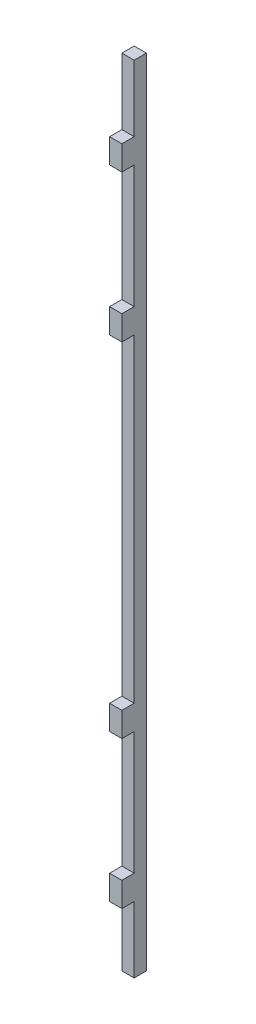
ISO-10303-21;
HEADER;
FILE_DESCRIPTION(('STEP AP214'),'2;1');
FILE_NAME('part.step','',(''),(''),'','','');
FILE_SCHEMA(('AUTOMOTIVE_DESIGN { 1 0 10303 214 1 1 1 1 }'));
ENDSEC;
DATA;
#1=APPLICATION_CONTEXT('core data for automotive mechanical design processes');
#2=APPLICATION_PROTOCOL_DEFINITION('international standard','automotive_design',2000,#1);
#3=PRODUCT_CONTEXT('',#1,'mechanical');
#4=PRODUCT('Part','Part','',(#3));
#5=PRODUCT_RELATED_PRODUCT_CATEGORY('part','',(#4));
#6=PRODUCT_DEFINITION_FORMATION('','',#4);
#7=PRODUCT_DEFINITION_CONTEXT('part definition',#1,'design');
#8=PRODUCT_DEFINITION('design','',#6,#7);
#9=PRODUCT_DEFINITION_SHAPE('','',#8);
#10=(LENGTH_UNIT() NAMED_UNIT(*) SI_UNIT(.MILLI.,.METRE.));
#11=(NAMED_UNIT(*) PLANE_ANGLE_UNIT() SI_UNIT($,.RADIAN.));
#12=(NAMED_UNIT(*) SI_UNIT($,.STERADIAN.) SOLID_ANGLE_UNIT());
#13=UNCERTAINTY_MEASURE_WITH_UNIT(LENGTH_MEASURE(1.E-05),#10,'distance_accuracy_value','');
#14=(GEOMETRIC_REPRESENTATION_CONTEXT(3) GLOBAL_UNCERTAINTY_ASSIGNED_CONTEXT((#13)) GLOBAL_UNIT_ASSIGNED_CONTEXT((#10,
#11,#12)) REPRESENTATION_CONTEXT('',''));
#15=CARTESIAN_POINT('',(0.,0.,0.));
#16=DIRECTION('',(0.,0.,1.));
#17=DIRECTION('',(1.,0.,0.));
#18=AXIS2_PLACEMENT_3D('',#15,#16,#17);
#19=CARTESIAN_POINT('',(2.5,0.,-5.));
#20=DIRECTION('',(0.,0.,1.));
#21=DIRECTION('',(1.,0.,0.));
#22=AXIS2_PLACEMENT_3D('',#19,#20,#21);
#23=PLANE('',#22);
#24=DIRECTION('',(0.,1.,0.));
#25=VECTOR('',#24,1.);
#26=CARTESIAN_POINT('',(-2.5,0.,-5.));
#27=LINE('',#26,#25);
#28=CARTESIAN_POINT('',(-2.5,-162.,-5.));
#29=VERTEX_POINT('',#28);
#30=CARTESIAN_POINT('',(-2.5,162.,-5.));
#31=VERTEX_POINT('',#30);
#32=EDGE_CURVE('E153',#29,#31,#27,.T.);
#33=ORIENTED_EDGE('',*,*,#32,.T.);
#34=DIRECTION('',(-1.,0.,0.));
#35=VECTOR('',#34,1.);
#36=CARTESIAN_POINT('',(2.5,162.,-5.));
#37=LINE('',#36,#35);
#38=CARTESIAN_POINT('',(2.5,162.,-5.));
#39=VERTEX_POINT('',#38);
#40=EDGE_CURVE('E11',#39,#31,#37,.T.);
#41=ORIENTED_EDGE('',*,*,#40,.F.);
#42=DIRECTION('',(0.,1.,0.));
#43=VECTOR('',#42,1.);
#44=CARTESIAN_POINT('',(2.5,0.,-5.));
#45=LINE('',#44,#43);
#46=CARTESIAN_POINT('',(2.5,-162.,-5.));
#47=VERTEX_POINT('',#46);
#48=EDGE_CURVE('E213',#47,#39,#45,.T.);
#49=ORIENTED_EDGE('',*,*,#48,.F.);
#50=DIRECTION('',(-1.,0.,0.));
#51=VECTOR('',#50,1.);
#52=CARTESIAN_POINT('',(2.5,-162.,-5.));
#53=LINE('',#52,#51);
#54=EDGE_CURVE('E258',#47,#29,#53,.T.);
#55=ORIENTED_EDGE('',*,*,#54,.T.);
#56=EDGE_LOOP('',(#33,#41,#49,#55));
#57=FACE_BOUND('',#56,.T.);
#58=ADVANCED_FACE('F40',(#57),#23,.F.);
#59=CARTESIAN_POINT('',(2.5,162.,0.));
#60=DIRECTION('',(0.,-1.,0.));
#61=DIRECTION('',(0.,0.,-1.));
#62=AXIS2_PLACEMENT_3D('',#59,#60,#61);
#63=PLANE('',#62);
#64=DIRECTION('',(0.,0.,1.));
#65=VECTOR('',#64,1.);
#66=CARTESIAN_POINT('',(-2.5,162.,0.));
#67=LINE('',#66,#65);
#68=CARTESIAN_POINT('',(-2.5,162.,0.));
#69=VERTEX_POINT('',#68);
#70=EDGE_CURVE('E156',#31,#69,#67,.T.);
#71=ORIENTED_EDGE('',*,*,#70,.T.);
#72=DIRECTION('',(-1.,0.,0.));
#73=VECTOR('',#72,1.);
#74=CARTESIAN_POINT('',(2.5,162.,0.));
#75=LINE('',#74,#73);
#76=CARTESIAN_POINT('',(2.5,162.,0.));
#77=VERTEX_POINT('',#76);
#78=EDGE_CURVE('E48',#77,#69,#75,.T.);
#79=ORIENTED_EDGE('',*,*,#78,.F.);
#80=DIRECTION('',(0.,0.,1.));
#81=VECTOR('',#80,1.);
#82=CARTESIAN_POINT('',(2.5,162.,0.));
#83=LINE('',#82,#81);
#84=EDGE_CURVE('E101',#39,#77,#83,.T.);
#85=ORIENTED_EDGE('',*,*,#84,.F.);
#86=ORIENTED_EDGE('',*,*,#40,.T.);
#87=EDGE_LOOP('',(#71,#79,#85,#86));
#88=FACE_BOUND('',#87,.T.);
#89=ADVANCED_FACE('F196',(#88),#63,.F.);
#90=CARTESIAN_POINT('',(2.5,0.,0.));
#91=DIRECTION('',(0.,0.,1.));
#92=DIRECTION('',(1.,0.,0.));
#93=AXIS2_PLACEMENT_3D('',#90,#91,#92);
#94=PLANE('',#93);
#95=DIRECTION('',(0.,1.,0.));
#96=VECTOR('',#95,1.);
#97=CARTESIAN_POINT('',(-2.5,0.,0.));
#98=LINE('',#97,#96);
#99=CARTESIAN_POINT('',(-2.5,135.,0.));
#100=VERTEX_POINT('',#99);
#101=EDGE_CURVE('E160',#100,#69,#98,.T.);
#102=ORIENTED_EDGE('',*,*,#101,.F.);
#103=DIRECTION('',(-1.,0.,0.));
#104=VECTOR('',#103,1.);
#105=CARTESIAN_POINT('',(2.5,135.,0.));
#106=LINE('',#105,#104);
#107=CARTESIAN_POINT('',(2.5,135.,0.));
#108=VERTEX_POINT('',#107);
#109=EDGE_CURVE('E189',#108,#100,#106,.T.);
#110=ORIENTED_EDGE('',*,*,#109,.F.);
#111=DIRECTION('',(0.,1.,0.));
#112=VECTOR('',#111,1.);
#113=CARTESIAN_POINT('',(2.5,0.,0.));
#114=LINE('',#113,#112);
#115=EDGE_CURVE('E195',#108,#77,#114,.T.);
#116=ORIENTED_EDGE('',*,*,#115,.T.);
#117=ORIENTED_EDGE('',*,*,#78,.T.);
#118=EDGE_LOOP('',(#102,#110,#116,#117));
#119=FACE_BOUND('',#118,.T.);
#120=ADVANCED_FACE('F193',(#119),#94,.T.);
#121=CARTESIAN_POINT('',(2.5,135.,0.));
#122=DIRECTION('',(0.,-1.,0.));
#123=DIRECTION('',(0.,0.,-1.));
#124=AXIS2_PLACEMENT_3D('',#121,#122,#123);
#125=PLANE('',#124);
#126=DIRECTION('',(0.,0.,1.));
#127=VECTOR('',#126,1.);
#128=CARTESIAN_POINT('',(-2.5,135.,0.));
#129=LINE('',#128,#127);
#130=CARTESIAN_POINT('',(-2.5,135.,5.));
#131=VERTEX_POINT('',#130);
#132=EDGE_CURVE('E163',#100,#131,#129,.T.);
#133=ORIENTED_EDGE('',*,*,#132,.T.);
#134=DIRECTION('',(-1.,0.,0.));
#135=VECTOR('',#134,1.);
#136=CARTESIAN_POINT('',(2.5,135.,5.));
#137=LINE('',#136,#135);
#138=CARTESIAN_POINT('',(2.5,135.,5.));
#139=VERTEX_POINT('',#138);
#140=EDGE_CURVE('E187',#139,#131,#137,.T.);
#141=ORIENTED_EDGE('',*,*,#140,.F.);
#142=DIRECTION('',(0.,0.,1.));
#143=VECTOR('',#142,1.);
#144=CARTESIAN_POINT('',(2.5,135.,0.));
#145=LINE('',#144,#143);
#146=EDGE_CURVE('E208',#108,#139,#145,.T.);
#147=ORIENTED_EDGE('',*,*,#146,.F.);
#148=ORIENTED_EDGE('',*,*,#109,.T.);
#149=EDGE_LOOP('',(#133,#141,#147,#148));
#150=FACE_BOUND('',#149,.T.);
#151=ADVANCED_FACE('F205',(#150),#125,.F.);
#152=CARTESIAN_POINT('',(2.5,0.,5.));
#153=DIRECTION('',(0.,0.,1.));
#154=DIRECTION('',(1.,0.,0.));
#155=AXIS2_PLACEMENT_3D('',#152,#153,#154);
#156=PLANE('',#155);
#157=DIRECTION('',(0.,1.,0.));
#158=VECTOR('',#157,1.);
#159=CARTESIAN_POINT('',(-2.5,0.,5.));
#160=LINE('',#159,#158);
#161=CARTESIAN_POINT('',(-2.5,125.,5.));
#162=VERTEX_POINT('',#161);
#163=EDGE_CURVE('E168',#162,#131,#160,.T.);
#164=ORIENTED_EDGE('',*,*,#163,.F.);
#165=DIRECTION('',(-1.,0.,0.));
#166=VECTOR('',#165,1.);
#167=CARTESIAN_POINT('',(2.5,125.,5.));
#168=LINE('',#167,#166);
#169=CARTESIAN_POINT('',(2.5,125.,5.));
#170=VERTEX_POINT('',#169);
#171=EDGE_CURVE('E185',#170,#162,#168,.T.);
#172=ORIENTED_EDGE('',*,*,#171,.F.);
#173=DIRECTION('',(0.,1.,0.));
#174=VECTOR('',#173,1.);
#175=CARTESIAN_POINT('',(2.5,0.,5.));
#176=LINE('',#175,#174);
#177=EDGE_CURVE('E210',#170,#139,#176,.T.);
#178=ORIENTED_EDGE('',*,*,#177,.T.);
#179=ORIENTED_EDGE('',*,*,#140,.T.);
#180=EDGE_LOOP('',(#164,#172,#178,#179));
#181=FACE_BOUND('',#180,.T.);
#182=ADVANCED_FACE('F221',(#181),#156,.T.);
#183=CARTESIAN_POINT('',(2.5,125.,0.));
#184=DIRECTION('',(0.,-1.,0.));
#185=DIRECTION('',(0.,0.,-1.));
#186=AXIS2_PLACEMENT_3D('',#183,#184,#185);
#187=PLANE('',#186);
#188=DIRECTION('',(0.,0.,1.));
#189=VECTOR('',#188,1.);
#190=CARTESIAN_POINT('',(-2.5,125.,0.));
#191=LINE('',#190,#189);
#192=CARTESIAN_POINT('',(-2.5,125.,0.));
#193=VERTEX_POINT('',#192);
#194=EDGE_CURVE('E171',#193,#162,#191,.T.);
#195=ORIENTED_EDGE('',*,*,#194,.F.);
#196=DIRECTION('',(-1.,0.,0.));
#197=VECTOR('',#196,1.);
#198=CARTESIAN_POINT('',(2.5,125.,0.));
#199=LINE('',#198,#197);
#200=CARTESIAN_POINT('',(2.5,125.,0.));
#201=VERTEX_POINT('',#200);
#202=EDGE_CURVE('E183',#201,#193,#199,.T.);
#203=ORIENTED_EDGE('',*,*,#202,.F.);
#204=DIRECTION('',(0.,0.,1.));
#205=VECTOR('',#204,1.);
#206=CARTESIAN_POINT('',(2.5,125.,0.));
#207=LINE('',#206,#205);
#208=EDGE_CURVE('E215',#201,#170,#207,.T.);
#209=ORIENTED_EDGE('',*,*,#208,.T.);
#210=ORIENTED_EDGE('',*,*,#171,.T.);
#211=EDGE_LOOP('',(#195,#203,#209,#210));
#212=FACE_BOUND('',#211,.T.);
#213=ADVANCED_FACE('F223',(#212),#187,.T.);
#214=CARTESIAN_POINT('',(-2.5,75.,0.));
#215=VERTEX_POINT('',#214);
#216=EDGE_CURVE('E165',#215,#193,#98,.T.);
#217=ORIENTED_EDGE('',*,*,#216,.F.);
#218=DIRECTION('',(-1.,0.,0.));
#219=VECTOR('',#218,1.);
#220=CARTESIAN_POINT('',(2.5,75.,0.));
#221=LINE('',#220,#219);
#222=CARTESIAN_POINT('',(2.5,75.,0.));
#223=VERTEX_POINT('',#222);
#224=EDGE_CURVE('E144',#223,#215,#221,.T.);
#225=ORIENTED_EDGE('',*,*,#224,.F.);
#226=EDGE_CURVE('E134',#223,#201,#114,.T.);
#227=ORIENTED_EDGE('',*,*,#226,.T.);
#228=ORIENTED_EDGE('',*,*,#202,.T.);
#229=EDGE_LOOP('',(#217,#225,#227,#228));
#230=FACE_BOUND('',#229,.T.);
#231=ADVANCED_FACE('F396',(#230),#94,.T.);
#232=CARTESIAN_POINT('',(2.5,75.,0.));
#233=DIRECTION('',(0.,-1.,0.));
#234=DIRECTION('',(0.,0.,-1.));
#235=AXIS2_PLACEMENT_3D('',#232,#233,#234);
#236=PLANE('',#235);
#237=DIRECTION('',(0.,0.,1.));
#238=VECTOR('',#237,1.);
#239=CARTESIAN_POINT('',(-2.5,75.,0.));
#240=LINE('',#239,#238);
#241=CARTESIAN_POINT('',(-2.5,75.,5.));
#242=VERTEX_POINT('',#241);
#243=EDGE_CURVE('E141',#215,#242,#240,.T.);
#244=ORIENTED_EDGE('',*,*,#243,.T.);
#245=DIRECTION('',(-1.,0.,0.));
#246=VECTOR('',#245,1.);
#247=CARTESIAN_POINT('',(2.5,75.,5.));
#248=LINE('',#247,#246);
#249=CARTESIAN_POINT('',(2.5,75.,5.));
#250=VERTEX_POINT('',#249);
#251=EDGE_CURVE('E138',#250,#242,#248,.T.);
#252=ORIENTED_EDGE('',*,*,#251,.F.);
#253=DIRECTION('',(0.,0.,1.));
#254=VECTOR('',#253,1.);
#255=CARTESIAN_POINT('',(2.5,75.,0.));
#256=LINE('',#255,#254);
#257=EDGE_CURVE('E127',#223,#250,#256,.T.);
#258=ORIENTED_EDGE('',*,*,#257,.F.);
#259=ORIENTED_EDGE('',*,*,#224,.T.);
#260=EDGE_LOOP('',(#244,#252,#258,#259));
#261=FACE_BOUND('',#260,.T.);
#262=ADVANCED_FACE('F139',(#261),#236,.F.);
#263=CARTESIAN_POINT('',(2.5,0.,5.));
#264=DIRECTION('',(0.,0.,1.));
#265=DIRECTION('',(1.,0.,0.));
#266=AXIS2_PLACEMENT_3D('',#263,#264,#265);
#267=PLANE('',#266);
#268=DIRECTION('',(0.,1.,0.));
#269=VECTOR('',#268,1.);
#270=CARTESIAN_POINT('',(-2.5,0.,5.));
#271=LINE('',#270,#269);
#272=CARTESIAN_POINT('',(-2.5,65.,5.));
#273=VERTEX_POINT('',#272);
#274=EDGE_CURVE('E175',#273,#242,#271,.T.);
#275=ORIENTED_EDGE('',*,*,#274,.F.);
#276=DIRECTION('',(-1.,0.,0.));
#277=VECTOR('',#276,1.);
#278=CARTESIAN_POINT('',(2.5,65.,5.));
#279=LINE('',#278,#277);
#280=CARTESIAN_POINT('',(2.5,65.,5.));
#281=VERTEX_POINT('',#280);
#282=EDGE_CURVE('E89',#281,#273,#279,.T.);
#283=ORIENTED_EDGE('',*,*,#282,.F.);
#284=DIRECTION('',(0.,1.,0.));
#285=VECTOR('',#284,1.);
#286=CARTESIAN_POINT('',(2.5,0.,5.));
#287=LINE('',#286,#285);
#288=EDGE_CURVE('E131',#281,#250,#287,.T.);
#289=ORIENTED_EDGE('',*,*,#288,.T.);
#290=ORIENTED_EDGE('',*,*,#251,.T.);
#291=EDGE_LOOP('',(#275,#283,#289,#290));
#292=FACE_BOUND('',#291,.T.);
#293=ADVANCED_FACE('F146',(#292),#267,.T.);
#294=CARTESIAN_POINT('',(2.5,65.,0.));
#295=DIRECTION('',(0.,-1.,0.));
#296=DIRECTION('',(0.,0.,-1.));
#297=AXIS2_PLACEMENT_3D('',#294,#295,#296);
#298=PLANE('',#297);
#299=DIRECTION('',(0.,0.,1.));
#300=VECTOR('',#299,1.);
#301=CARTESIAN_POINT('',(-2.5,65.,0.));
#302=LINE('',#301,#300);
#303=CARTESIAN_POINT('',(-2.5,65.,0.));
#304=VERTEX_POINT('',#303);
#305=EDGE_CURVE('E177',#304,#273,#302,.T.);
#306=ORIENTED_EDGE('',*,*,#305,.F.);
#307=DIRECTION('',(-1.,0.,0.));
#308=VECTOR('',#307,1.);
#309=CARTESIAN_POINT('',(2.5,65.,0.));
#310=LINE('',#309,#308);
#311=CARTESIAN_POINT('',(2.5,65.,0.));
#312=VERTEX_POINT('',#311);
#313=EDGE_CURVE('E56',#312,#304,#310,.T.);
#314=ORIENTED_EDGE('',*,*,#313,.F.);
#315=DIRECTION('',(0.,0.,1.));
#316=VECTOR('',#315,1.);
#317=CARTESIAN_POINT('',(2.5,65.,0.));
#318=LINE('',#317,#316);
#319=EDGE_CURVE('E147',#312,#281,#318,.T.);
#320=ORIENTED_EDGE('',*,*,#319,.T.);
#321=ORIENTED_EDGE('',*,*,#282,.T.);
#322=EDGE_LOOP('',(#306,#314,#320,#321));
#323=FACE_BOUND('',#322,.T.);
#324=ADVANCED_FACE('F409',(#323),#298,.T.);
#325=CARTESIAN_POINT('',(-2.5,-65.,0.));
#326=VERTEX_POINT('',#325);
#327=EDGE_CURVE('E164',#326,#304,#98,.T.);
#328=ORIENTED_EDGE('',*,*,#327,.F.);
#329=DIRECTION('',(-1.,0.,0.));
#330=VECTOR('',#329,1.);
#331=CARTESIAN_POINT('',(2.5,-65.,0.));
#332=LINE('',#331,#330);
#333=CARTESIAN_POINT('',(2.5,-65.,0.));
#334=VERTEX_POINT('',#333);
#335=EDGE_CURVE('E157',#334,#326,#332,.T.);
#336=ORIENTED_EDGE('',*,*,#335,.F.);
#337=EDGE_CURVE('E149',#334,#312,#114,.T.);
#338=ORIENTED_EDGE('',*,*,#337,.T.);
#339=ORIENTED_EDGE('',*,*,#313,.T.);
#340=EDGE_LOOP('',(#328,#336,#338,#339));
#341=FACE_BOUND('',#340,.T.);
#342=ADVANCED_FACE('F397',(#341),#94,.T.);
#343=CARTESIAN_POINT('',(2.5,0.,0.));
#344=DIRECTION('',(1.,0.,0.));
#345=DIRECTION('',(0.,0.,-1.));
#346=AXIS2_PLACEMENT_3D('',#343,#344,#345);
#347=PLANE('',#346);
#348=ORIENTED_EDGE('',*,*,#48,.T.);
#349=ORIENTED_EDGE('',*,*,#84,.T.);
#350=ORIENTED_EDGE('',*,*,#115,.F.);
#351=ORIENTED_EDGE('',*,*,#146,.T.);
#352=ORIENTED_EDGE('',*,*,#177,.F.);
#353=ORIENTED_EDGE('',*,*,#208,.F.);
#354=ORIENTED_EDGE('',*,*,#226,.F.);
#355=ORIENTED_EDGE('',*,*,#257,.T.);
#356=ORIENTED_EDGE('',*,*,#288,.F.);
#357=ORIENTED_EDGE('',*,*,#319,.F.);
#358=ORIENTED_EDGE('',*,*,#337,.F.);
#359=DIRECTION('',(0.,0.,1.));
#360=VECTOR('',#359,1.);
#361=CARTESIAN_POINT('',(2.5,-65.,0.));
#362=LINE('',#361,#360);
#363=CARTESIAN_POINT('',(2.5,-65.,5.));
#364=VERTEX_POINT('',#363);
#365=EDGE_CURVE('E265',#334,#364,#362,.T.);
#366=ORIENTED_EDGE('',*,*,#365,.T.);
#367=DIRECTION('',(0.,-1.,0.));
#368=VECTOR('',#367,1.);
#369=CARTESIAN_POINT('',(2.5,0.,5.));
#370=LINE('',#369,#368);
#371=CARTESIAN_POINT('',(2.5,-75.,5.));
#372=VERTEX_POINT('',#371);
#373=EDGE_CURVE('E304',#364,#372,#370,.T.);
#374=ORIENTED_EDGE('',*,*,#373,.T.);
#375=DIRECTION('',(0.,0.,1.));
#376=VECTOR('',#375,1.);
#377=CARTESIAN_POINT('',(2.5,-75.,0.));
#378=LINE('',#377,#376);
#379=CARTESIAN_POINT('',(2.5,-75.,0.));
#380=VERTEX_POINT('',#379);
#381=EDGE_CURVE('E301',#380,#372,#378,.T.);
#382=ORIENTED_EDGE('',*,*,#381,.F.);
#383=DIRECTION('',(0.,-1.,0.));
#384=VECTOR('',#383,1.);
#385=CARTESIAN_POINT('',(2.5,0.,0.));
#386=LINE('',#385,#384);
#387=CARTESIAN_POINT('',(2.5,-125.,0.));
#388=VERTEX_POINT('',#387);
#389=EDGE_CURVE('E300',#380,#388,#386,.T.);
#390=ORIENTED_EDGE('',*,*,#389,.T.);
#391=DIRECTION('',(0.,0.,1.));
#392=VECTOR('',#391,1.);
#393=CARTESIAN_POINT('',(2.5,-125.,0.));
#394=LINE('',#393,#392);
#395=CARTESIAN_POINT('',(2.5,-125.,5.));
#396=VERTEX_POINT('',#395);
#397=EDGE_CURVE('E297',#388,#396,#394,.T.);
#398=ORIENTED_EDGE('',*,*,#397,.T.);
#399=DIRECTION('',(0.,-1.,0.));
#400=VECTOR('',#399,1.);
#401=CARTESIAN_POINT('',(2.5,0.,5.));
#402=LINE('',#401,#400);
#403=CARTESIAN_POINT('',(2.5,-135.,5.));
#404=VERTEX_POINT('',#403);
#405=EDGE_CURVE('E294',#396,#404,#402,.T.);
#406=ORIENTED_EDGE('',*,*,#405,.T.);
#407=DIRECTION('',(0.,0.,1.));
#408=VECTOR('',#407,1.);
#409=CARTESIAN_POINT('',(2.5,-135.,0.));
#410=LINE('',#409,#408);
#411=CARTESIAN_POINT('',(2.5,-135.,0.));
#412=VERTEX_POINT('',#411);
#413=EDGE_CURVE('E291',#412,#404,#410,.T.);
#414=ORIENTED_EDGE('',*,*,#413,.F.);
#415=CARTESIAN_POINT('',(2.5,-162.,0.));
#416=VERTEX_POINT('',#415);
#417=EDGE_CURVE('E290',#412,#416,#386,.T.);
#418=ORIENTED_EDGE('',*,*,#417,.T.);
#419=DIRECTION('',(0.,0.,1.));
#420=VECTOR('',#419,1.);
#421=CARTESIAN_POINT('',(2.5,-162.,0.));
#422=LINE('',#421,#420);
#423=EDGE_CURVE('E261',#47,#416,#422,.T.);
#424=ORIENTED_EDGE('',*,*,#423,.F.);
#425=EDGE_LOOP('',(#348,#349,#350,#351,#352,#353,#354,#355,#356,#357,#358,#366,#374,#382,#390,
#398,#406,#414,#418,#424));
#426=FACE_BOUND('',#425,.T.);
#427=ADVANCED_FACE('F129',(#426),#347,.T.);
#428=CARTESIAN_POINT('',(-2.5,0.,0.));
#429=DIRECTION('',(1.,0.,0.));
#430=DIRECTION('',(0.,0.,-1.));
#431=AXIS2_PLACEMENT_3D('',#428,#429,#430);
#432=PLANE('',#431);
#433=ORIENTED_EDGE('',*,*,#32,.F.);
#434=DIRECTION('',(0.,0.,1.));
#435=VECTOR('',#434,1.);
#436=CARTESIAN_POINT('',(-2.5,-162.,0.));
#437=LINE('',#436,#435);
#438=CARTESIAN_POINT('',(-2.5,-162.,0.));
#439=VERTEX_POINT('',#438);
#440=EDGE_CURVE('E262',#29,#439,#437,.T.);
#441=ORIENTED_EDGE('',*,*,#440,.T.);
#442=DIRECTION('',(0.,-1.,0.));
#443=VECTOR('',#442,1.);
#444=CARTESIAN_POINT('',(-2.5,0.,0.));
#445=LINE('',#444,#443);
#446=CARTESIAN_POINT('',(-2.5,-135.,0.));
#447=VERTEX_POINT('',#446);
#448=EDGE_CURVE('E266',#447,#439,#445,.T.);
#449=ORIENTED_EDGE('',*,*,#448,.F.);
#450=DIRECTION('',(0.,0.,1.));
#451=VECTOR('',#450,1.);
#452=CARTESIAN_POINT('',(-2.5,-135.,0.));
#453=LINE('',#452,#451);
#454=CARTESIAN_POINT('',(-2.5,-135.,5.));
#455=VERTEX_POINT('',#454);
#456=EDGE_CURVE('E267',#447,#455,#453,.T.);
#457=ORIENTED_EDGE('',*,*,#456,.T.);
#458=DIRECTION('',(0.,-1.,0.));
#459=VECTOR('',#458,1.);
#460=CARTESIAN_POINT('',(-2.5,0.,5.));
#461=LINE('',#460,#459);
#462=CARTESIAN_POINT('',(-2.5,-125.,5.));
#463=VERTEX_POINT('',#462);
#464=EDGE_CURVE('E270',#463,#455,#461,.T.);
#465=ORIENTED_EDGE('',*,*,#464,.F.);
#466=DIRECTION('',(0.,0.,1.));
#467=VECTOR('',#466,1.);
#468=CARTESIAN_POINT('',(-2.5,-125.,0.));
#469=LINE('',#468,#467);
#470=CARTESIAN_POINT('',(-2.5,-125.,0.));
#471=VERTEX_POINT('',#470);
#472=EDGE_CURVE('E273',#471,#463,#469,.T.);
#473=ORIENTED_EDGE('',*,*,#472,.F.);
#474=CARTESIAN_POINT('',(-2.5,-75.,0.));
#475=VERTEX_POINT('',#474);
#476=EDGE_CURVE('E276',#475,#471,#445,.T.);
#477=ORIENTED_EDGE('',*,*,#476,.F.);
#478=DIRECTION('',(0.,0.,1.));
#479=VECTOR('',#478,1.);
#480=CARTESIAN_POINT('',(-2.5,-75.,0.));
#481=LINE('',#480,#479);
#482=CARTESIAN_POINT('',(-2.5,-75.,5.));
#483=VERTEX_POINT('',#482);
#484=EDGE_CURVE('E277',#475,#483,#481,.T.);
#485=ORIENTED_EDGE('',*,*,#484,.T.);
#486=DIRECTION('',(0.,-1.,0.));
#487=VECTOR('',#486,1.);
#488=CARTESIAN_POINT('',(-2.5,0.,5.));
#489=LINE('',#488,#487);
#490=CARTESIAN_POINT('',(-2.5,-65.,5.));
#491=VERTEX_POINT('',#490);
#492=EDGE_CURVE('E280',#491,#483,#489,.T.);
#493=ORIENTED_EDGE('',*,*,#492,.F.);
#494=DIRECTION('',(0.,0.,1.));
#495=VECTOR('',#494,1.);
#496=CARTESIAN_POINT('',(-2.5,-65.,0.));
#497=LINE('',#496,#495);
#498=EDGE_CURVE('E283',#326,#491,#497,.T.);
#499=ORIENTED_EDGE('',*,*,#498,.F.);
#500=ORIENTED_EDGE('',*,*,#327,.T.);
#501=ORIENTED_EDGE('',*,*,#305,.T.);
#502=ORIENTED_EDGE('',*,*,#274,.T.);
#503=ORIENTED_EDGE('',*,*,#243,.F.);
#504=ORIENTED_EDGE('',*,*,#216,.T.);
#505=ORIENTED_EDGE('',*,*,#194,.T.);
#506=ORIENTED_EDGE('',*,*,#163,.T.);
#507=ORIENTED_EDGE('',*,*,#132,.F.);
#508=ORIENTED_EDGE('',*,*,#101,.T.);
#509=ORIENTED_EDGE('',*,*,#70,.F.);
#510=EDGE_LOOP('',(#433,#441,#449,#457,#465,#473,#477,#485,#493,#499,#500,#501,#502,#503,#504,
#505,#506,#507,#508,#509));
#511=FACE_BOUND('',#510,.T.);
#512=ADVANCED_FACE('F201',(#511),#432,.F.);
#513=CARTESIAN_POINT('',(2.5,-65.,0.));
#514=DIRECTION('',(0.,-1.,0.));
#515=DIRECTION('',(0.,0.,-1.));
#516=AXIS2_PLACEMENT_3D('',#513,#514,#515);
#517=PLANE('',#516);
#518=ORIENTED_EDGE('',*,*,#498,.T.);
#519=DIRECTION('',(-1.,0.,0.));
#520=VECTOR('',#519,1.);
#521=CARTESIAN_POINT('',(2.5,-65.,5.));
#522=LINE('',#521,#520);
#523=EDGE_CURVE('E234',#364,#491,#522,.T.);
#524=ORIENTED_EDGE('',*,*,#523,.F.);
#525=ORIENTED_EDGE('',*,*,#365,.F.);
#526=ORIENTED_EDGE('',*,*,#335,.T.);
#527=EDGE_LOOP('',(#518,#524,#525,#526));
#528=FACE_BOUND('',#527,.T.);
#529=ADVANCED_FACE('F413',(#528),#517,.F.);
#530=CARTESIAN_POINT('',(2.5,0.,5.));
#531=DIRECTION('',(0.,0.,-1.));
#532=DIRECTION('',(-1.,0.,0.));
#533=AXIS2_PLACEMENT_3D('',#530,#531,#532);
#534=PLANE('',#533);
#535=ORIENTED_EDGE('',*,*,#492,.T.);
#536=DIRECTION('',(-1.,0.,0.));
#537=VECTOR('',#536,1.);
#538=CARTESIAN_POINT('',(2.5,-75.,5.));
#539=LINE('',#538,#537);
#540=EDGE_CURVE('E237',#372,#483,#539,.T.);
#541=ORIENTED_EDGE('',*,*,#540,.F.);
#542=ORIENTED_EDGE('',*,*,#373,.F.);
#543=ORIENTED_EDGE('',*,*,#523,.T.);
#544=EDGE_LOOP('',(#535,#541,#542,#543));
#545=FACE_BOUND('',#544,.T.);
#546=ADVANCED_FACE('F418',(#545),#534,.F.);
#547=CARTESIAN_POINT('',(2.5,-75.,0.));
#548=DIRECTION('',(0.,-1.,0.));
#549=DIRECTION('',(0.,0.,-1.));
#550=AXIS2_PLACEMENT_3D('',#547,#548,#549);
#551=PLANE('',#550);
#552=ORIENTED_EDGE('',*,*,#484,.F.);
#553=DIRECTION('',(-1.,0.,0.));
#554=VECTOR('',#553,1.);
#555=CARTESIAN_POINT('',(2.5,-75.,0.));
#556=LINE('',#555,#554);
#557=EDGE_CURVE('E240',#380,#475,#556,.T.);
#558=ORIENTED_EDGE('',*,*,#557,.F.);
#559=ORIENTED_EDGE('',*,*,#381,.T.);
#560=ORIENTED_EDGE('',*,*,#540,.T.);
#561=EDGE_LOOP('',(#552,#558,#559,#560));
#562=FACE_BOUND('',#561,.T.);
#563=ADVANCED_FACE('F375',(#562),#551,.T.);
#564=CARTESIAN_POINT('',(2.5,0.,0.));
#565=DIRECTION('',(0.,0.,-1.));
#566=DIRECTION('',(-1.,0.,0.));
#567=AXIS2_PLACEMENT_3D('',#564,#565,#566);
#568=PLANE('',#567);
#569=ORIENTED_EDGE('',*,*,#476,.T.);
#570=DIRECTION('',(-1.,0.,0.));
#571=VECTOR('',#570,1.);
#572=CARTESIAN_POINT('',(2.5,-125.,0.));
#573=LINE('',#572,#571);
#574=EDGE_CURVE('E243',#388,#471,#573,.T.);
#575=ORIENTED_EDGE('',*,*,#574,.F.);
#576=ORIENTED_EDGE('',*,*,#389,.F.);
#577=ORIENTED_EDGE('',*,*,#557,.T.);
#578=EDGE_LOOP('',(#569,#575,#576,#577));
#579=FACE_BOUND('',#578,.T.);
#580=ADVANCED_FACE('F326',(#579),#568,.F.);
#581=CARTESIAN_POINT('',(2.5,-125.,0.));
#582=DIRECTION('',(0.,-1.,0.));
#583=DIRECTION('',(0.,0.,-1.));
#584=AXIS2_PLACEMENT_3D('',#581,#582,#583);
#585=PLANE('',#584);
#586=ORIENTED_EDGE('',*,*,#472,.T.);
#587=DIRECTION('',(-1.,0.,0.));
#588=VECTOR('',#587,1.);
#589=CARTESIAN_POINT('',(2.5,-125.,5.));
#590=LINE('',#589,#588);
#591=EDGE_CURVE('E246',#396,#463,#590,.T.);
#592=ORIENTED_EDGE('',*,*,#591,.F.);
#593=ORIENTED_EDGE('',*,*,#397,.F.);
#594=ORIENTED_EDGE('',*,*,#574,.T.);
#595=EDGE_LOOP('',(#586,#592,#593,#594));
#596=FACE_BOUND('',#595,.T.);
#597=ADVANCED_FACE('F331',(#596),#585,.F.);
#598=CARTESIAN_POINT('',(2.5,0.,5.));
#599=DIRECTION('',(0.,0.,-1.));
#600=DIRECTION('',(-1.,0.,0.));
#601=AXIS2_PLACEMENT_3D('',#598,#599,#600);
#602=PLANE('',#601);
#603=ORIENTED_EDGE('',*,*,#464,.T.);
#604=DIRECTION('',(-1.,0.,0.));
#605=VECTOR('',#604,1.);
#606=CARTESIAN_POINT('',(2.5,-135.,5.));
#607=LINE('',#606,#605);
#608=EDGE_CURVE('E249',#404,#455,#607,.T.);
#609=ORIENTED_EDGE('',*,*,#608,.F.);
#610=ORIENTED_EDGE('',*,*,#405,.F.);
#611=ORIENTED_EDGE('',*,*,#591,.T.);
#612=EDGE_LOOP('',(#603,#609,#610,#611));
#613=FACE_BOUND('',#612,.T.);
#614=ADVANCED_FACE('F339',(#613),#602,.F.);
#615=CARTESIAN_POINT('',(2.5,-135.,0.));
#616=DIRECTION('',(0.,-1.,0.));
#617=DIRECTION('',(0.,0.,-1.));
#618=AXIS2_PLACEMENT_3D('',#615,#616,#617);
#619=PLANE('',#618);
#620=ORIENTED_EDGE('',*,*,#456,.F.);
#621=DIRECTION('',(-1.,0.,0.));
#622=VECTOR('',#621,1.);
#623=CARTESIAN_POINT('',(2.5,-135.,0.));
#624=LINE('',#623,#622);
#625=EDGE_CURVE('E252',#412,#447,#624,.T.);
#626=ORIENTED_EDGE('',*,*,#625,.F.);
#627=ORIENTED_EDGE('',*,*,#413,.T.);
#628=ORIENTED_EDGE('',*,*,#608,.T.);
#629=EDGE_LOOP('',(#620,#626,#627,#628));
#630=FACE_BOUND('',#629,.T.);
#631=ADVANCED_FACE('F380',(#630),#619,.T.);
#632=ORIENTED_EDGE('',*,*,#448,.T.);
#633=DIRECTION('',(-1.,0.,0.));
#634=VECTOR('',#633,1.);
#635=CARTESIAN_POINT('',(2.5,-162.,0.));
#636=LINE('',#635,#634);
#637=EDGE_CURVE('E255',#416,#439,#636,.T.);
#638=ORIENTED_EDGE('',*,*,#637,.F.);
#639=ORIENTED_EDGE('',*,*,#417,.F.);
#640=ORIENTED_EDGE('',*,*,#625,.T.);
#641=EDGE_LOOP('',(#632,#638,#639,#640));
#642=FACE_BOUND('',#641,.T.);
#643=ADVANCED_FACE('F382',(#642),#568,.F.);
#644=CARTESIAN_POINT('',(2.5,-162.,0.));
#645=DIRECTION('',(0.,-1.,0.));
#646=DIRECTION('',(0.,0.,-1.));
#647=AXIS2_PLACEMENT_3D('',#644,#645,#646);
#648=PLANE('',#647);
#649=ORIENTED_EDGE('',*,*,#440,.F.);
#650=ORIENTED_EDGE('',*,*,#54,.F.);
#651=ORIENTED_EDGE('',*,*,#423,.T.);
#652=ORIENTED_EDGE('',*,*,#637,.T.);
#653=EDGE_LOOP('',(#649,#650,#651,#652));
#654=FACE_BOUND('',#653,.T.);
#655=ADVANCED_FACE('F384',(#654),#648,.T.);
#656=CLOSED_SHELL('',(#58,#89,#120,#151,#182,#213,#231,#262,#293,#324,#342,#427,#512,#529,#546,
#563,#580,#597,#614,#631,#643,#655));
#657=MANIFOLD_SOLID_BREP('B2',#656);
#658=ADVANCED_BREP_SHAPE_REPRESENTATION('',(#18,#657),#14);
#659=SHAPE_DEFINITION_REPRESENTATION(#9,#658);
ENDSEC;
END-ISO-10303-21;
